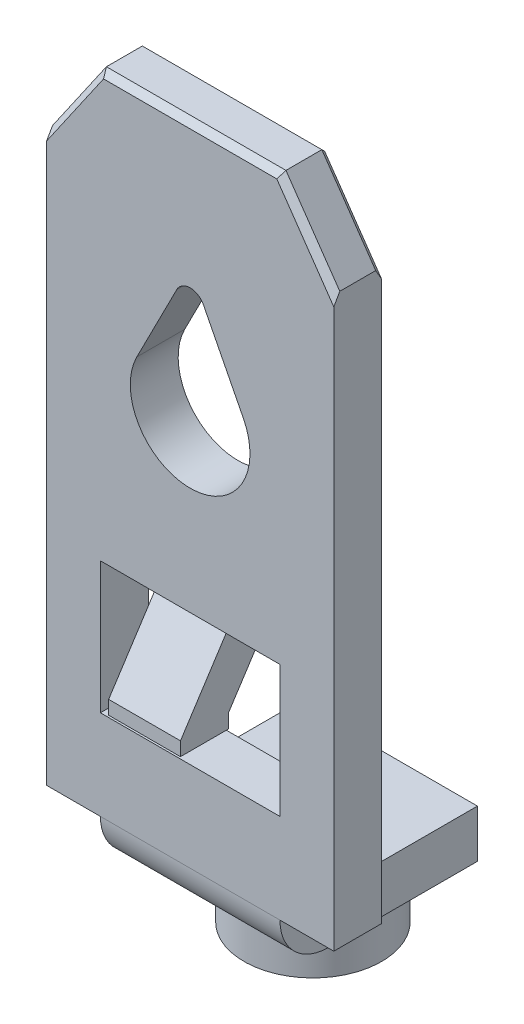
ISO-10303-21;
HEADER;
FILE_DESCRIPTION(('STEP AP214'),'2;1');
FILE_NAME('part.step','',(''),(''),'','','');
FILE_SCHEMA(('AUTOMOTIVE_DESIGN { 1 0 10303 214 1 1 1 1 }'));
ENDSEC;
DATA;
#1=APPLICATION_CONTEXT('core data for automotive mechanical design processes');
#2=APPLICATION_PROTOCOL_DEFINITION('international standard','automotive_design',2000,#1);
#3=PRODUCT_CONTEXT('',#1,'mechanical');
#4=PRODUCT('Part','Part','',(#3));
#5=PRODUCT_RELATED_PRODUCT_CATEGORY('part','',(#4));
#6=PRODUCT_DEFINITION_FORMATION('','',#4);
#7=PRODUCT_DEFINITION_CONTEXT('part definition',#1,'design');
#8=PRODUCT_DEFINITION('design','',#6,#7);
#9=PRODUCT_DEFINITION_SHAPE('','',#8);
#10=(LENGTH_UNIT() NAMED_UNIT(*) SI_UNIT(.MILLI.,.METRE.));
#11=(NAMED_UNIT(*) PLANE_ANGLE_UNIT() SI_UNIT($,.RADIAN.));
#12=(NAMED_UNIT(*) SI_UNIT($,.STERADIAN.) SOLID_ANGLE_UNIT());
#13=UNCERTAINTY_MEASURE_WITH_UNIT(LENGTH_MEASURE(1.E-05),#10,'distance_accuracy_value','');
#14=(GEOMETRIC_REPRESENTATION_CONTEXT(3) GLOBAL_UNCERTAINTY_ASSIGNED_CONTEXT((#13)) GLOBAL_UNIT_ASSIGNED_CONTEXT((#10,
#11,#12)) REPRESENTATION_CONTEXT('',''));
#15=CARTESIAN_POINT('',(0.,0.,0.));
#16=DIRECTION('',(0.,0.,1.));
#17=DIRECTION('',(1.,0.,0.));
#18=AXIS2_PLACEMENT_3D('',#15,#16,#17);
#19=CARTESIAN_POINT('',(4.00000001490116,1.22586121977757,1.56249464902104));
#20=DIRECTION('',(0.,0.,1.));
#21=DIRECTION('',(1.,0.,0.));
#22=AXIS2_PLACEMENT_3D('',#19,#20,#21);
#23=PLANE('',#22);
#24=DIRECTION('',(1.,0.,0.));
#25=VECTOR('',#24,1.);
#26=CARTESIAN_POINT('',(2.80000001490116,1.22586121977757,1.56249464902104));
#27=LINE('',#26,#25);
#28=CARTESIAN_POINT('',(2.80000001490116,1.22586121977757,1.56249464902104));
#29=VERTEX_POINT('',#28);
#30=CARTESIAN_POINT('',(4.00000001490116,1.22586121977757,1.56249464902104));
#31=VERTEX_POINT('',#30);
#32=EDGE_CURVE('E41',#29,#31,#27,.T.);
#33=ORIENTED_EDGE('',*,*,#32,.F.);
#34=DIRECTION('',(0.,-1.,0.));
#35=VECTOR('',#34,1.);
#36=CARTESIAN_POINT('',(2.80000001490116,1.22586121977757,1.56249464902104));
#37=LINE('',#36,#35);
#38=CARTESIAN_POINT('',(2.80000001490116,0.995861219777567,1.56249464902104));
#39=VERTEX_POINT('',#38);
#40=EDGE_CURVE('E11',#29,#39,#37,.T.);
#41=ORIENTED_EDGE('',*,*,#40,.T.);
#42=DIRECTION('',(-1.,0.,0.));
#43=VECTOR('',#42,1.);
#44=CARTESIAN_POINT('',(2.80000001490116,0.995861219777567,1.56249464902104));
#45=LINE('',#44,#43);
#46=CARTESIAN_POINT('',(4.00000001490116,0.995861219777567,1.56249464902104));
#47=VERTEX_POINT('',#46);
#48=EDGE_CURVE('E458',#47,#39,#45,.T.);
#49=ORIENTED_EDGE('',*,*,#48,.F.);
#50=DIRECTION('',(0.,-1.,0.));
#51=VECTOR('',#50,1.);
#52=CARTESIAN_POINT('',(4.00000001490116,1.22586121977757,1.56249464902104));
#53=LINE('',#52,#51);
#54=EDGE_CURVE('E431',#31,#47,#53,.T.);
#55=ORIENTED_EDGE('',*,*,#54,.F.);
#56=EDGE_LOOP('',(#33,#41,#49,#55));
#57=FACE_BOUND('',#56,.T.);
#58=ADVANCED_FACE('F17',(#57),#23,.T.);
#59=CARTESIAN_POINT('',(2.80000001490116,1.22586121977757,0.762494649021038));
#60=DIRECTION('',(0.,0.,-1.));
#61=DIRECTION('',(0.,-1.,0.));
#62=AXIS2_PLACEMENT_3D('',#59,#60,#61);
#63=PLANE('',#62);
#64=DIRECTION('',(1.,0.,0.));
#65=VECTOR('',#64,1.);
#66=CARTESIAN_POINT('',(2.80000001490116,1.22586121977757,0.762494649021038));
#67=LINE('',#66,#65);
#68=CARTESIAN_POINT('',(2.80000001490116,1.22586121977757,0.762494649021038));
#69=VERTEX_POINT('',#68);
#70=CARTESIAN_POINT('',(4.00000001490116,1.22586121977757,0.762494649021038));
#71=VERTEX_POINT('',#70);
#72=EDGE_CURVE('E28',#69,#71,#67,.T.);
#73=ORIENTED_EDGE('',*,*,#72,.T.);
#74=DIRECTION('',(0.,-1.,0.));
#75=VECTOR('',#74,1.);
#76=CARTESIAN_POINT('',(4.00000001490116,1.22586121977757,0.762494649021038));
#77=LINE('',#76,#75);
#78=CARTESIAN_POINT('',(4.00000001490116,0.995861219777567,0.762494649021038));
#79=VERTEX_POINT('',#78);
#80=EDGE_CURVE('E352',#71,#79,#77,.T.);
#81=ORIENTED_EDGE('',*,*,#80,.T.);
#82=DIRECTION('',(1.,0.,0.));
#83=VECTOR('',#82,1.);
#84=CARTESIAN_POINT('',(2.80000001490116,0.995861219777567,0.762494649021038));
#85=LINE('',#84,#83);
#86=CARTESIAN_POINT('',(2.80000001490116,0.995861219777567,0.762494649021038));
#87=VERTEX_POINT('',#86);
#88=EDGE_CURVE('E373',#87,#79,#85,.T.);
#89=ORIENTED_EDGE('',*,*,#88,.F.);
#90=DIRECTION('',(0.,-1.,0.));
#91=VECTOR('',#90,1.);
#92=CARTESIAN_POINT('',(2.80000001490116,1.22586121977757,0.762494649021038));
#93=LINE('',#92,#91);
#94=EDGE_CURVE('E430',#69,#87,#93,.T.);
#95=ORIENTED_EDGE('',*,*,#94,.F.);
#96=EDGE_LOOP('',(#73,#81,#89,#95));
#97=FACE_BOUND('',#96,.T.);
#98=ADVANCED_FACE('F19',(#97),#63,.T.);
#99=CARTESIAN_POINT('',(2.80000001490116,0.995861219777567,1.56249464902104));
#100=DIRECTION('',(0.,-1.,0.));
#101=DIRECTION('',(0.,0.,-1.));
#102=AXIS2_PLACEMENT_3D('',#99,#100,#101);
#103=PLANE('',#102);
#104=DIRECTION('',(0.,0.,-1.));
#105=VECTOR('',#104,1.);
#106=CARTESIAN_POINT('',(2.80000001490116,0.995861219777567,0.762494649021038));
#107=LINE('',#106,#105);
#108=EDGE_CURVE('E356',#39,#87,#107,.T.);
#109=ORIENTED_EDGE('',*,*,#108,.T.);
#110=ORIENTED_EDGE('',*,*,#88,.T.);
#111=DIRECTION('',(0.,0.,1.));
#112=VECTOR('',#111,1.);
#113=CARTESIAN_POINT('',(4.00000001490116,0.995861219777567,0.762494649021038));
#114=LINE('',#113,#112);
#115=EDGE_CURVE('E454',#79,#47,#114,.T.);
#116=ORIENTED_EDGE('',*,*,#115,.T.);
#117=ORIENTED_EDGE('',*,*,#48,.T.);
#118=EDGE_LOOP('',(#109,#110,#116,#117));
#119=FACE_BOUND('',#118,.T.);
#120=ADVANCED_FACE('F710',(#119),#103,.T.);
#121=CARTESIAN_POINT('',(2.80000001490116,1.22586121977757,0.762494649021038));
#122=DIRECTION('',(0.,-0.544639035015027,-0.838670567945424));
#123=DIRECTION('',(0.,-0.838670567945424,0.544639035015027));
#124=AXIS2_PLACEMENT_3D('',#121,#122,#123);
#125=PLANE('',#124);
#126=DIRECTION('',(0.,-0.838670567945424,0.544639035015027));
#127=VECTOR('',#126,1.);
#128=CARTESIAN_POINT('',(2.80000001490116,2.40000001490116,0.));
#129=LINE('',#128,#127);
#130=CARTESIAN_POINT('',(2.80000001490116,2.40000001490116,0.));
#131=VERTEX_POINT('',#130);
#132=EDGE_CURVE('E335',#131,#69,#129,.T.);
#133=ORIENTED_EDGE('',*,*,#132,.F.);
#134=DIRECTION('',(1.,0.,0.));
#135=VECTOR('',#134,1.);
#136=CARTESIAN_POINT('',(1.90000001490116,2.40000001490116,0.));
#137=LINE('',#136,#135);
#138=CARTESIAN_POINT('',(4.00000001490116,2.40000001490116,0.));
#139=VERTEX_POINT('',#138);
#140=EDGE_CURVE('E482',#131,#139,#137,.T.);
#141=ORIENTED_EDGE('',*,*,#140,.T.);
#142=DIRECTION('',(0.,0.838670567945424,-0.544639035015027));
#143=VECTOR('',#142,1.);
#144=CARTESIAN_POINT('',(4.00000001490116,2.40000001490116,0.));
#145=LINE('',#144,#143);
#146=EDGE_CURVE('E331',#71,#139,#145,.T.);
#147=ORIENTED_EDGE('',*,*,#146,.F.);
#148=ORIENTED_EDGE('',*,*,#72,.F.);
#149=EDGE_LOOP('',(#133,#141,#147,#148));
#150=FACE_BOUND('',#149,.T.);
#151=ADVANCED_FACE('F869',(#150),#125,.T.);
#152=CARTESIAN_POINT('',(2.80000001490116,2.40000001490116,0.8));
#153=DIRECTION('',(0.,0.544639035015027,0.838670567945424));
#154=DIRECTION('',(1.,0.,0.));
#155=AXIS2_PLACEMENT_3D('',#152,#153,#154);
#156=PLANE('',#155);
#157=DIRECTION('',(0.,-0.838670567945424,0.544639035015027));
#158=VECTOR('',#157,1.);
#159=CARTESIAN_POINT('',(2.80000001490116,2.40000001490116,0.8));
#160=LINE('',#159,#158);
#161=CARTESIAN_POINT('',(2.80000001490116,2.40000001490116,0.8));
#162=VERTEX_POINT('',#161);
#163=EDGE_CURVE('E334',#162,#29,#160,.T.);
#164=ORIENTED_EDGE('',*,*,#163,.T.);
#165=ORIENTED_EDGE('',*,*,#32,.T.);
#166=DIRECTION('',(0.,-0.838670567945424,0.544639035015027));
#167=VECTOR('',#166,1.);
#168=CARTESIAN_POINT('',(4.00000001490116,2.40000001490116,0.8));
#169=LINE('',#168,#167);
#170=CARTESIAN_POINT('',(4.00000001490116,2.40000001490116,0.8));
#171=VERTEX_POINT('',#170);
#172=EDGE_CURVE('E426',#171,#31,#169,.T.);
#173=ORIENTED_EDGE('',*,*,#172,.F.);
#174=DIRECTION('',(1.,0.,0.));
#175=VECTOR('',#174,1.);
#176=CARTESIAN_POINT('',(1.90000001490116,2.40000001490116,0.8));
#177=LINE('',#176,#175);
#178=EDGE_CURVE('E300',#162,#171,#177,.T.);
#179=ORIENTED_EDGE('',*,*,#178,.F.);
#180=EDGE_LOOP('',(#164,#165,#173,#179));
#181=FACE_BOUND('',#180,.T.);
#182=ADVANCED_FACE('F690',(#181),#156,.T.);
#183=CARTESIAN_POINT('',(2.80000001490116,1.81293061733936,0.781247324510519));
#184=DIRECTION('',(-1.,0.,0.));
#185=DIRECTION('',(0.,0.,1.));
#186=AXIS2_PLACEMENT_3D('',#183,#184,#185);
#187=PLANE('',#186);
#188=DIRECTION('',(0.,0.,1.));
#189=VECTOR('',#188,1.);
#190=CARTESIAN_POINT('',(2.80000001490116,2.40000001490116,0.390623662255259));
#191=LINE('',#190,#189);
#192=EDGE_CURVE('E526',#131,#162,#191,.T.);
#193=ORIENTED_EDGE('',*,*,#192,.F.);
#194=ORIENTED_EDGE('',*,*,#132,.T.);
#195=ORIENTED_EDGE('',*,*,#94,.T.);
#196=ORIENTED_EDGE('',*,*,#108,.F.);
#197=ORIENTED_EDGE('',*,*,#40,.F.);
#198=ORIENTED_EDGE('',*,*,#163,.F.);
#199=EDGE_LOOP('',(#193,#194,#195,#196,#197,#198));
#200=FACE_BOUND('',#199,.T.);
#201=ADVANCED_FACE('F868',(#200),#187,.T.);
#202=CARTESIAN_POINT('',(4.00000001490116,1.81293061733936,0.781247324510519));
#203=DIRECTION('',(1.,0.,0.));
#204=DIRECTION('',(0.,1.,0.));
#205=AXIS2_PLACEMENT_3D('',#202,#203,#204);
#206=PLANE('',#205);
#207=DIRECTION('',(0.,0.,-1.));
#208=VECTOR('',#207,1.);
#209=CARTESIAN_POINT('',(4.00000001490116,2.40000001490116,0.390623662255259));
#210=LINE('',#209,#208);
#211=EDGE_CURVE('E318',#171,#139,#210,.T.);
#212=ORIENTED_EDGE('',*,*,#211,.F.);
#213=ORIENTED_EDGE('',*,*,#172,.T.);
#214=ORIENTED_EDGE('',*,*,#54,.T.);
#215=ORIENTED_EDGE('',*,*,#115,.F.);
#216=ORIENTED_EDGE('',*,*,#80,.F.);
#217=ORIENTED_EDGE('',*,*,#146,.T.);
#218=EDGE_LOOP('',(#212,#213,#214,#215,#216,#217));
#219=FACE_BOUND('',#218,.T.);
#220=ADVANCED_FACE('F687',(#219),#206,.T.);
#221=CARTESIAN_POINT('',(4.00000001490116,2.40000001490116,0.));
#222=DIRECTION('',(0.,-1.,0.));
#223=DIRECTION('',(0.,0.,-1.));
#224=AXIS2_PLACEMENT_3D('',#221,#222,#223);
#225=PLANE('',#224);
#226=ORIENTED_EDGE('',*,*,#211,.T.);
#227=DIRECTION('',(1.,0.,0.));
#228=VECTOR('',#227,1.);
#229=CARTESIAN_POINT('',(1.90000001490116,2.40000001490116,0.));
#230=LINE('',#229,#228);
#231=CARTESIAN_POINT('',(4.90000001490116,2.40000001490116,0.));
#232=VERTEX_POINT('',#231);
#233=EDGE_CURVE('E314',#139,#232,#230,.T.);
#234=ORIENTED_EDGE('',*,*,#233,.T.);
#235=DIRECTION('',(0.,0.,1.));
#236=VECTOR('',#235,1.);
#237=CARTESIAN_POINT('',(4.90000001490116,2.40000001490116,0.));
#238=LINE('',#237,#236);
#239=CARTESIAN_POINT('',(4.90000001490116,2.40000001490116,0.8));
#240=VERTEX_POINT('',#239);
#241=EDGE_CURVE('E319',#232,#240,#238,.T.);
#242=ORIENTED_EDGE('',*,*,#241,.T.);
#243=DIRECTION('',(1.,0.,0.));
#244=VECTOR('',#243,1.);
#245=CARTESIAN_POINT('',(1.90000001490116,2.40000001490116,0.8));
#246=LINE('',#245,#244);
#247=EDGE_CURVE('E303',#171,#240,#246,.T.);
#248=ORIENTED_EDGE('',*,*,#247,.F.);
#249=EDGE_LOOP('',(#226,#234,#242,#248));
#250=FACE_BOUND('',#249,.T.);
#251=ADVANCED_FACE('F691',(#250),#225,.T.);
#252=CARTESIAN_POINT('',(4.00000001490116,2.40000001490116,0.));
#253=DIRECTION('',(0.,-1.,0.));
#254=DIRECTION('',(0.,0.,-1.));
#255=AXIS2_PLACEMENT_3D('',#252,#253,#254);
#256=PLANE('',#255);
#257=ORIENTED_EDGE('',*,*,#192,.T.);
#258=DIRECTION('',(1.,0.,0.));
#259=VECTOR('',#258,1.);
#260=CARTESIAN_POINT('',(1.90000001490116,2.40000001490116,0.8));
#261=LINE('',#260,#259);
#262=CARTESIAN_POINT('',(1.90000001490116,2.40000001490116,0.8));
#263=VERTEX_POINT('',#262);
#264=EDGE_CURVE('E302',#263,#162,#261,.T.);
#265=ORIENTED_EDGE('',*,*,#264,.F.);
#266=DIRECTION('',(0.,0.,1.));
#267=VECTOR('',#266,1.);
#268=CARTESIAN_POINT('',(1.90000001490116,2.40000001490116,0.));
#269=LINE('',#268,#267);
#270=CARTESIAN_POINT('',(1.90000001490116,2.40000001490116,0.));
#271=VERTEX_POINT('',#270);
#272=EDGE_CURVE('E487',#271,#263,#269,.T.);
#273=ORIENTED_EDGE('',*,*,#272,.F.);
#274=DIRECTION('',(1.,0.,0.));
#275=VECTOR('',#274,1.);
#276=CARTESIAN_POINT('',(1.90000001490116,2.40000001490116,0.));
#277=LINE('',#276,#275);
#278=EDGE_CURVE('E529',#271,#131,#277,.T.);
#279=ORIENTED_EDGE('',*,*,#278,.T.);
#280=EDGE_LOOP('',(#257,#265,#273,#279));
#281=FACE_BOUND('',#280,.T.);
#282=ADVANCED_FACE('F680',(#281),#256,.T.);
#283=CARTESIAN_POINT('',(3.40000001490116,3.70000001490116,0.));
#284=DIRECTION('',(0.,0.,1.));
#285=DIRECTION('',(1.,0.,0.));
#286=AXIS2_PLACEMENT_3D('',#283,#284,#285);
#287=PLANE('',#286);
#288=DIRECTION('',(-1.,0.,0.));
#289=VECTOR('',#288,1.);
#290=CARTESIAN_POINT('',(4.37500001490116,-1.29999998509884,0.));
#291=LINE('',#290,#289);
#292=CARTESIAN_POINT('',(5.80000001490116,-1.29999998509884,0.));
#293=VERTEX_POINT('',#292);
#294=CARTESIAN_POINT('',(4.90000001490116,-1.29999998509884,0.));
#295=VERTEX_POINT('',#294);
#296=EDGE_CURVE('E365',#293,#295,#291,.T.);
#297=ORIENTED_EDGE('',*,*,#296,.T.);
#298=DIRECTION('',(-1.,0.,0.));
#299=VECTOR('',#298,1.);
#300=CARTESIAN_POINT('',(2.65000001490116,-1.29999998509884,0.));
#301=LINE('',#300,#299);
#302=CARTESIAN_POINT('',(1.90000001490116,-1.29999998509884,0.));
#303=VERTEX_POINT('',#302);
#304=EDGE_CURVE('E361',#295,#303,#301,.T.);
#305=ORIENTED_EDGE('',*,*,#304,.T.);
#306=DIRECTION('',(-1.,0.,0.));
#307=VECTOR('',#306,1.);
#308=CARTESIAN_POINT('',(2.42500001490116,-1.29999998509884,0.));
#309=LINE('',#308,#307);
#310=CARTESIAN_POINT('',(1.00000001490116,-1.29999998509884,0.));
#311=VERTEX_POINT('',#310);
#312=EDGE_CURVE('E366',#303,#311,#309,.T.);
#313=ORIENTED_EDGE('',*,*,#312,.T.);
#314=DIRECTION('',(0.,1.,0.));
#315=VECTOR('',#314,1.);
#316=CARTESIAN_POINT('',(1.00000001490116,1.00000001490116,0.));
#317=LINE('',#316,#315);
#318=CARTESIAN_POINT('',(1.00000001490116,8.02431792266959,0.));
#319=VERTEX_POINT('',#318);
#320=EDGE_CURVE('E374',#311,#319,#317,.T.);
#321=ORIENTED_EDGE('',*,*,#320,.T.);
#322=DIRECTION('',(-0.569209978830308,-0.822192191643779,0.));
#323=VECTOR('',#322,1.);
#324=CARTESIAN_POINT('',(0.868019234065539,7.83367901701813,0.));
#325=LINE('',#324,#323);
#326=CARTESIAN_POINT('',(1.95239530952302,9.40000001490116,0.));
#327=VERTEX_POINT('',#326);
#328=EDGE_CURVE('E211',#327,#319,#325,.T.);
#329=ORIENTED_EDGE('',*,*,#328,.F.);
#330=DIRECTION('',(-1.,0.,0.));
#331=VECTOR('',#330,1.);
#332=CARTESIAN_POINT('',(4.15000001490116,9.40000001490116,0.));
#333=LINE('',#332,#331);
#334=CARTESIAN_POINT('',(4.8476047202793,9.40000001490116,0.));
#335=VERTEX_POINT('',#334);
#336=EDGE_CURVE('E357',#335,#327,#333,.T.);
#337=ORIENTED_EDGE('',*,*,#336,.F.);
#338=DIRECTION('',(-0.569209978830308,0.822192191643779,0.));
#339=VECTOR('',#338,1.);
#340=CARTESIAN_POINT('',(6.38198079573678,7.18367901701813,0.));
#341=LINE('',#340,#339);
#342=CARTESIAN_POINT('',(5.80000001490116,8.02431792266959,0.));
#343=VERTEX_POINT('',#342);
#344=EDGE_CURVE('E351',#343,#335,#341,.T.);
#345=ORIENTED_EDGE('',*,*,#344,.F.);
#346=DIRECTION('',(0.,1.,0.));
#347=VECTOR('',#346,1.);
#348=CARTESIAN_POINT('',(5.80000001490116,-1.29999998509884,0.));
#349=LINE('',#348,#347);
#350=EDGE_CURVE('E327',#293,#343,#349,.T.);
#351=ORIENTED_EDGE('',*,*,#350,.F.);
#352=EDGE_LOOP('',(#297,#305,#313,#321,#329,#337,#345,#351));
#353=FACE_BOUND('',#352,.T.);
#354=CARTESIAN_POINT('',(3.39907908867342,5.20000001490116,0.));
#355=DIRECTION('',(0.,0.,-1.));
#356=DIRECTION('',(-0.890723542830247,0.454545454545454,0.));
#357=AXIS2_PLACEMENT_3D('',#354,#355,#356);
#358=CIRCLE('',#357,1.);
#359=CARTESIAN_POINT('',(4.28980263150367,5.65454546944661,0.));
#360=VERTEX_POINT('',#359);
#361=CARTESIAN_POINT('',(2.50835554584317,5.65454546944662,0.));
#362=VERTEX_POINT('',#361);
#363=EDGE_CURVE('E255',#360,#362,#358,.T.);
#364=ORIENTED_EDGE('',*,*,#363,.F.);
#365=DIRECTION('',(0.454545454545455,-0.890723542830246,0.));
#366=VECTOR('',#365,1.);
#367=CARTESIAN_POINT('',(4.28980263150367,5.65454546944662,0.));
#368=LINE('',#367,#366);
#369=CARTESIAN_POINT('',(3.62175997438098,6.96363637853752,0.));
#370=VERTEX_POINT('',#369);
#371=EDGE_CURVE('E414',#370,#360,#368,.T.);
#372=ORIENTED_EDGE('',*,*,#371,.F.);
#373=CARTESIAN_POINT('',(3.39907908867342,6.85000001490116,0.));
#374=DIRECTION('',(0.,0.,-1.));
#375=DIRECTION('',(0.890723542830249,0.454545454545449,0.));
#376=AXIS2_PLACEMENT_3D('',#373,#374,#375);
#377=CIRCLE('',#376,0.25);
#378=CARTESIAN_POINT('',(3.17639820296586,6.96363637853752,0.));
#379=VERTEX_POINT('',#378);
#380=EDGE_CURVE('E274',#379,#370,#377,.T.);
#381=ORIENTED_EDGE('',*,*,#380,.F.);
#382=DIRECTION('',(0.454545454545455,0.890723542830246,0.));
#383=VECTOR('',#382,1.);
#384=CARTESIAN_POINT('',(2.50835554584317,5.65454546944662,0.));
#385=LINE('',#384,#383);
#386=EDGE_CURVE('E270',#362,#379,#385,.T.);
#387=ORIENTED_EDGE('',*,*,#386,.F.);
#388=EDGE_LOOP('',(#364,#372,#381,#387));
#389=FACE_BOUND('',#388,.T.);
#390=ORIENTED_EDGE('',*,*,#278,.F.);
#391=DIRECTION('',(0.,1.,0.));
#392=VECTOR('',#391,1.);
#393=CARTESIAN_POINT('',(1.90000001490116,2.40000001490116,0.));
#394=LINE('',#393,#392);
#395=CARTESIAN_POINT('',(1.90000001490116,0.200000014901161,0.));
#396=VERTEX_POINT('',#395);
#397=EDGE_CURVE('E309',#396,#271,#394,.T.);
#398=ORIENTED_EDGE('',*,*,#397,.F.);
#399=DIRECTION('',(-1.,0.,0.));
#400=VECTOR('',#399,1.);
#401=CARTESIAN_POINT('',(1.90000001490116,0.200000014901161,0.));
#402=LINE('',#401,#400);
#403=CARTESIAN_POINT('',(4.90000001490116,0.200000014901161,0.));
#404=VERTEX_POINT('',#403);
#405=EDGE_CURVE('E287',#404,#396,#402,.T.);
#406=ORIENTED_EDGE('',*,*,#405,.F.);
#407=DIRECTION('',(0.,-1.,0.));
#408=VECTOR('',#407,1.);
#409=CARTESIAN_POINT('',(4.90000001490116,1.00000001490116,0.));
#410=LINE('',#409,#408);
#411=EDGE_CURVE('E308',#232,#404,#410,.T.);
#412=ORIENTED_EDGE('',*,*,#411,.F.);
#413=ORIENTED_EDGE('',*,*,#233,.F.);
#414=ORIENTED_EDGE('',*,*,#140,.F.);
#415=EDGE_LOOP('',(#390,#398,#406,#412,#413,#414));
#416=FACE_BOUND('',#415,.T.);
#417=ADVANCED_FACE('F271',(#353,#389,#416),#287,.F.);
#418=CARTESIAN_POINT('',(3.40000001490116,-2.09999998509884,-1.25));
#419=DIRECTION('',(0.,-1.,0.));
#420=DIRECTION('',(1.,0.,0.));
#421=AXIS2_PLACEMENT_3D('',#418,#419,#420);
#422=CYLINDRICAL_SURFACE('',#421,1.15);
#423=CARTESIAN_POINT('',(3.40000001490116,-3.09999998509884,-1.25));
#424=DIRECTION('',(0.,-1.,0.));
#425=DIRECTION('',(1.,0.,0.));
#426=AXIS2_PLACEMENT_3D('',#423,#424,#425);
#427=CIRCLE('',#426,1.15);
#428=CARTESIAN_POINT('',(2.25000001490116,-3.09999998509884,-1.25));
#429=VERTEX_POINT('',#428);
#430=EDGE_CURVE('E378',#429,#429,#427,.T.);
#431=ORIENTED_EDGE('',*,*,#430,.F.);
#432=DIRECTION('',(0.,1.,0.));
#433=VECTOR('',#432,1.);
#434=CARTESIAN_POINT('',(2.25000001490116,-2.09999998509884,-1.25));
#435=LINE('',#434,#433);
#436=CARTESIAN_POINT('',(2.25000001490116,-2.09999998509884,-1.25));
#437=VERTEX_POINT('',#436);
#438=EDGE_CURVE('E377',#429,#437,#435,.T.);
#439=ORIENTED_EDGE('',*,*,#438,.T.);
#440=CARTESIAN_POINT('',(3.40000001490116,-2.09999998509884,-1.25));
#441=DIRECTION('',(0.,1.,0.));
#442=DIRECTION('',(1.,0.,0.));
#443=AXIS2_PLACEMENT_3D('',#440,#441,#442);
#444=CIRCLE('',#443,1.15);
#445=EDGE_CURVE('E419',#437,#437,#444,.T.);
#446=ORIENTED_EDGE('',*,*,#445,.F.);
#447=ORIENTED_EDGE('',*,*,#438,.F.);
#448=EDGE_LOOP('',(#431,#439,#446,#447));
#449=FACE_BOUND('',#448,.T.);
#450=ADVANCED_FACE('F820',(#449),#422,.T.);
#451=CARTESIAN_POINT('',(3.40000001490116,-3.09999998509884,-1.25));
#452=DIRECTION('',(0.,-1.,0.));
#453=DIRECTION('',(0.,0.,-1.));
#454=AXIS2_PLACEMENT_3D('',#451,#452,#453);
#455=PLANE('',#454);
#456=ORIENTED_EDGE('',*,*,#430,.T.);
#457=EDGE_LOOP('',(#456));
#458=FACE_BOUND('',#457,.T.);
#459=ADVANCED_FACE('F714',(#458),#455,.T.);
#460=CARTESIAN_POINT('',(2.20000001490116,-1.29999998509884,0.));
#461=DIRECTION('',(1.,0.,0.));
#462=DIRECTION('',(0.,-0.707106781186548,0.707106781186548));
#463=AXIS2_PLACEMENT_3D('',#460,#461,#462);
#464=CYLINDRICAL_SURFACE('',#463,0.8);
#465=CARTESIAN_POINT('',(4.90000001490116,-1.29999998509884,0.));
#466=DIRECTION('',(-1.,0.,0.));
#467=DIRECTION('',(0.,-0.707106781186548,0.707106781186548));
#468=AXIS2_PLACEMENT_3D('',#465,#466,#467);
#469=CIRCLE('',#468,0.8);
#470=CARTESIAN_POINT('',(4.90000001490116,-2.09999998509884,0.));
#471=VERTEX_POINT('',#470);
#472=CARTESIAN_POINT('',(4.90000001490116,-1.29999998509884,0.799999982118607));
#473=VERTEX_POINT('',#472);
#474=EDGE_CURVE('E298',#471,#473,#469,.T.);
#475=ORIENTED_EDGE('',*,*,#474,.T.);
#476=DIRECTION('',(-1.,0.,0.));
#477=VECTOR('',#476,1.);
#478=CARTESIAN_POINT('',(2.20000001490116,-1.29999998509884,0.8));
#479=LINE('',#478,#477);
#480=CARTESIAN_POINT('',(1.90000001490116,-1.29999998509884,0.799999982118607));
#481=VERTEX_POINT('',#480);
#482=EDGE_CURVE('E386',#473,#481,#479,.T.);
#483=ORIENTED_EDGE('',*,*,#482,.T.);
#484=CARTESIAN_POINT('',(1.90000001490116,-1.29999998509884,0.));
#485=DIRECTION('',(1.,0.,0.));
#486=DIRECTION('',(0.,-0.707106781186548,0.707106781186548));
#487=AXIS2_PLACEMENT_3D('',#484,#485,#486);
#488=CIRCLE('',#487,0.8);
#489=CARTESIAN_POINT('',(1.90000001490116,-2.09999998509884,0.));
#490=VERTEX_POINT('',#489);
#491=EDGE_CURVE('E382',#481,#490,#488,.T.);
#492=ORIENTED_EDGE('',*,*,#491,.T.);
#493=DIRECTION('',(1.,0.,0.));
#494=VECTOR('',#493,1.);
#495=CARTESIAN_POINT('',(2.20000001490116,-2.09999998509884,0.));
#496=LINE('',#495,#494);
#497=EDGE_CURVE('E387',#490,#471,#496,.T.);
#498=ORIENTED_EDGE('',*,*,#497,.T.);
#499=EDGE_LOOP('',(#475,#483,#492,#498));
#500=FACE_BOUND('',#499,.T.);
#501=ADVANCED_FACE('F554',(#500),#464,.T.);
#502=CARTESIAN_POINT('',(1.00000001490116,-2.09999998509884,0.));
#503=DIRECTION('',(0.,-1.,0.));
#504=DIRECTION('',(0.,0.,-1.));
#505=AXIS2_PLACEMENT_3D('',#502,#503,#504);
#506=PLANE('',#505);
#507=ORIENTED_EDGE('',*,*,#497,.F.);
#508=DIRECTION('',(0.,0.,-1.));
#509=VECTOR('',#508,1.);
#510=CARTESIAN_POINT('',(1.90000001490116,-2.09999998509884,0.399999991059303));
#511=LINE('',#510,#509);
#512=CARTESIAN_POINT('',(1.90000001490116,-2.09999998509884,-2.5));
#513=VERTEX_POINT('',#512);
#514=EDGE_CURVE('E478',#490,#513,#511,.T.);
#515=ORIENTED_EDGE('',*,*,#514,.T.);
#516=DIRECTION('',(-1.,0.,0.));
#517=VECTOR('',#516,1.);
#518=CARTESIAN_POINT('',(4.90000001490116,-2.09999998509884,-2.5));
#519=LINE('',#518,#517);
#520=CARTESIAN_POINT('',(4.90000001490116,-2.09999998509884,-2.5));
#521=VERTEX_POINT('',#520);
#522=EDGE_CURVE('E336',#521,#513,#519,.T.);
#523=ORIENTED_EDGE('',*,*,#522,.F.);
#524=DIRECTION('',(0.,0.,1.));
#525=VECTOR('',#524,1.);
#526=CARTESIAN_POINT('',(4.90000001490116,-2.09999998509884,0.));
#527=LINE('',#526,#525);
#528=EDGE_CURVE('E21',#521,#471,#527,.T.);
#529=ORIENTED_EDGE('',*,*,#528,.T.);
#530=EDGE_LOOP('',(#507,#515,#523,#529));
#531=FACE_BOUND('',#530,.T.);
#532=ORIENTED_EDGE('',*,*,#445,.T.);
#533=EDGE_LOOP('',(#532));
#534=FACE_BOUND('',#533,.T.);
#535=ADVANCED_FACE('F752',(#531,#534),#506,.T.);
#536=CARTESIAN_POINT('',(1.90000001490116,-2.09999998509884,0.));
#537=DIRECTION('',(-1.,0.,0.));
#538=DIRECTION('',(0.,0.,1.));
#539=AXIS2_PLACEMENT_3D('',#536,#537,#538);
#540=PLANE('',#539);
#541=ORIENTED_EDGE('',*,*,#491,.F.);
#542=DIRECTION('',(0.,0.,-1.));
#543=VECTOR('',#542,1.);
#544=CARTESIAN_POINT('',(1.90000001490116,-1.29999998509884,0.));
#545=LINE('',#544,#543);
#546=EDGE_CURVE('E423',#481,#303,#545,.T.);
#547=ORIENTED_EDGE('',*,*,#546,.T.);
#548=DIRECTION('',(0.,0.,-1.));
#549=VECTOR('',#548,1.);
#550=CARTESIAN_POINT('',(1.90000001490116,-1.29999998509884,0.));
#551=LINE('',#550,#549);
#552=CARTESIAN_POINT('',(1.90000001490116,-1.29999998509884,-2.5));
#553=VERTEX_POINT('',#552);
#554=EDGE_CURVE('E346',#303,#553,#551,.T.);
#555=ORIENTED_EDGE('',*,*,#554,.T.);
#556=DIRECTION('',(0.,1.,0.));
#557=VECTOR('',#556,1.);
#558=CARTESIAN_POINT('',(1.90000001490116,-2.09999998509884,-2.5));
#559=LINE('',#558,#557);
#560=EDGE_CURVE('E520',#513,#553,#559,.T.);
#561=ORIENTED_EDGE('',*,*,#560,.F.);
#562=ORIENTED_EDGE('',*,*,#514,.F.);
#563=EDGE_LOOP('',(#541,#547,#555,#561,#562));
#564=FACE_BOUND('',#563,.T.);
#565=ADVANCED_FACE('F743',(#564),#540,.T.);
#566=CARTESIAN_POINT('',(5.35000001490116,-1.29999998509884,0.4));
#567=DIRECTION('',(0.,1.,0.));
#568=DIRECTION('',(1.,0.,0.));
#569=AXIS2_PLACEMENT_3D('',#566,#567,#568);
#570=PLANE('',#569);
#571=DIRECTION('',(0.,0.,-1.));
#572=VECTOR('',#571,1.);
#573=CARTESIAN_POINT('',(5.80000001490116,-1.29999998509884,0.2));
#574=LINE('',#573,#572);
#575=CARTESIAN_POINT('',(5.80000001490116,-1.29999998509884,0.8));
#576=VERTEX_POINT('',#575);
#577=EDGE_CURVE('E342',#576,#293,#574,.T.);
#578=ORIENTED_EDGE('',*,*,#577,.F.);
#579=DIRECTION('',(1.,0.,0.));
#580=VECTOR('',#579,1.);
#581=CARTESIAN_POINT('',(4.37500001490116,-1.29999998509884,0.8));
#582=LINE('',#581,#580);
#583=EDGE_CURVE('E418',#473,#576,#582,.T.);
#584=ORIENTED_EDGE('',*,*,#583,.F.);
#585=DIRECTION('',(0.,0.,1.));
#586=VECTOR('',#585,1.);
#587=CARTESIAN_POINT('',(4.90000001490116,-1.29999998509884,0.));
#588=LINE('',#587,#586);
#589=EDGE_CURVE('E328',#295,#473,#588,.T.);
#590=ORIENTED_EDGE('',*,*,#589,.F.);
#591=ORIENTED_EDGE('',*,*,#296,.F.);
#592=EDGE_LOOP('',(#578,#584,#590,#591));
#593=FACE_BOUND('',#592,.T.);
#594=ADVANCED_FACE('F738',(#593),#570,.F.);
#595=CARTESIAN_POINT('',(1.45000001490116,-1.29999998509884,0.4));
#596=DIRECTION('',(0.,1.,0.));
#597=DIRECTION('',(1.,0.,0.));
#598=AXIS2_PLACEMENT_3D('',#595,#596,#597);
#599=PLANE('',#598);
#600=ORIENTED_EDGE('',*,*,#546,.F.);
#601=DIRECTION('',(1.,0.,0.));
#602=VECTOR('',#601,1.);
#603=CARTESIAN_POINT('',(2.42500001490116,-1.29999998509884,0.8));
#604=LINE('',#603,#602);
#605=CARTESIAN_POINT('',(1.00000001490116,-1.29999998509884,0.8));
#606=VERTEX_POINT('',#605);
#607=EDGE_CURVE('E573',#606,#481,#604,.T.);
#608=ORIENTED_EDGE('',*,*,#607,.F.);
#609=DIRECTION('',(0.,0.,1.));
#610=VECTOR('',#609,1.);
#611=CARTESIAN_POINT('',(1.00000001490116,-1.29999998509884,0.2));
#612=LINE('',#611,#610);
#613=EDGE_CURVE('E515',#311,#606,#612,.T.);
#614=ORIENTED_EDGE('',*,*,#613,.F.);
#615=ORIENTED_EDGE('',*,*,#312,.F.);
#616=EDGE_LOOP('',(#600,#608,#614,#615));
#617=FACE_BOUND('',#616,.T.);
#618=ADVANCED_FACE('F734',(#617),#599,.F.);
#619=CARTESIAN_POINT('',(5.80000001490116,-2.09999998509884,0.));
#620=DIRECTION('',(1.,0.,0.));
#621=DIRECTION('',(0.,1.,0.));
#622=AXIS2_PLACEMENT_3D('',#619,#620,#621);
#623=PLANE('',#622);
#624=ORIENTED_EDGE('',*,*,#577,.T.);
#625=ORIENTED_EDGE('',*,*,#350,.T.);
#626=DIRECTION('',(0.,-0.869072499313748,-0.494684738936382));
#627=VECTOR('',#626,1.);
#628=CARTESIAN_POINT('',(5.80000001490116,3.90496904973271,-2.34477448475905));
#629=LINE('',#628,#627);
#630=CARTESIAN_POINT('',(5.80000001490116,8.20000001490116,0.1));
#631=VERTEX_POINT('',#630);
#632=EDGE_CURVE('E347',#631,#343,#629,.T.);
#633=ORIENTED_EDGE('',*,*,#632,.F.);
#634=DIRECTION('',(0.,0.,1.));
#635=VECTOR('',#634,1.);
#636=CARTESIAN_POINT('',(5.80000001490116,8.20000001490116,0.));
#637=LINE('',#636,#635);
#638=CARTESIAN_POINT('',(5.80000001490116,8.20000001490116,0.7));
#639=VERTEX_POINT('',#638);
#640=EDGE_CURVE('E323',#631,#639,#637,.T.);
#641=ORIENTED_EDGE('',*,*,#640,.T.);
#642=DIRECTION('',(0.,0.869072499313748,-0.494684738936382));
#643=VECTOR('',#642,1.);
#644=CARTESIAN_POINT('',(5.80000001490116,4.07693581070864,3.04688928838443));
#645=LINE('',#644,#643);
#646=CARTESIAN_POINT('',(5.80000001490116,8.02431792266959,0.8));
#647=VERTEX_POINT('',#646);
#648=EDGE_CURVE('E417',#647,#639,#645,.T.);
#649=ORIENTED_EDGE('',*,*,#648,.F.);
#650=DIRECTION('',(0.,1.,0.));
#651=VECTOR('',#650,1.);
#652=CARTESIAN_POINT('',(5.80000001490116,-1.29999998509884,0.8));
#653=LINE('',#652,#651);
#654=EDGE_CURVE('E435',#576,#647,#653,.T.);
#655=ORIENTED_EDGE('',*,*,#654,.F.);
#656=EDGE_LOOP('',(#624,#625,#633,#641,#649,#655));
#657=FACE_BOUND('',#656,.T.);
#658=ADVANCED_FACE('F721',(#657),#623,.T.);
#659=CARTESIAN_POINT('',(4.90000001490116,-1.29999998509884,0.));
#660=DIRECTION('',(1.,0.,0.));
#661=DIRECTION('',(0.,1.,0.));
#662=AXIS2_PLACEMENT_3D('',#659,#660,#661);
#663=PLANE('',#662);
#664=ORIENTED_EDGE('',*,*,#474,.F.);
#665=ORIENTED_EDGE('',*,*,#528,.F.);
#666=DIRECTION('',(0.,-1.,0.));
#667=VECTOR('',#666,1.);
#668=CARTESIAN_POINT('',(4.90000001490116,-2.09999998509884,-2.5));
#669=LINE('',#668,#667);
#670=CARTESIAN_POINT('',(4.90000001490116,-1.29999998509884,-2.5));
#671=VERTEX_POINT('',#670);
#672=EDGE_CURVE('E340',#671,#521,#669,.T.);
#673=ORIENTED_EDGE('',*,*,#672,.F.);
#674=DIRECTION('',(0.,0.,-1.));
#675=VECTOR('',#674,1.);
#676=CARTESIAN_POINT('',(4.90000001490116,-1.29999998509884,0.));
#677=LINE('',#676,#675);
#678=EDGE_CURVE('E516',#295,#671,#677,.T.);
#679=ORIENTED_EDGE('',*,*,#678,.F.);
#680=ORIENTED_EDGE('',*,*,#589,.T.);
#681=EDGE_LOOP('',(#664,#665,#673,#679,#680));
#682=FACE_BOUND('',#681,.T.);
#683=ADVANCED_FACE('F559',(#682),#663,.T.);
#684=CARTESIAN_POINT('',(1.90000001490116,-1.29999998509884,0.));
#685=DIRECTION('',(0.,1.,0.));
#686=DIRECTION('',(1.,0.,0.));
#687=AXIS2_PLACEMENT_3D('',#684,#685,#686);
#688=PLANE('',#687);
#689=ORIENTED_EDGE('',*,*,#304,.F.);
#690=ORIENTED_EDGE('',*,*,#678,.T.);
#691=DIRECTION('',(1.,0.,0.));
#692=VECTOR('',#691,1.);
#693=CARTESIAN_POINT('',(1.00000001490116,-1.29999998509884,-2.5));
#694=LINE('',#693,#692);
#695=EDGE_CURVE('E486',#553,#671,#694,.T.);
#696=ORIENTED_EDGE('',*,*,#695,.F.);
#697=ORIENTED_EDGE('',*,*,#554,.F.);
#698=EDGE_LOOP('',(#689,#690,#696,#697));
#699=FACE_BOUND('',#698,.T.);
#700=ADVANCED_FACE('F720',(#699),#688,.T.);
#701=CARTESIAN_POINT('',(3.40000001490116,-1.69999998509884,-2.5));
#702=DIRECTION('',(0.,0.,-1.));
#703=DIRECTION('',(0.,-1.,0.));
#704=AXIS2_PLACEMENT_3D('',#701,#702,#703);
#705=PLANE('',#704);
#706=ORIENTED_EDGE('',*,*,#560,.T.);
#707=ORIENTED_EDGE('',*,*,#695,.T.);
#708=ORIENTED_EDGE('',*,*,#672,.T.);
#709=ORIENTED_EDGE('',*,*,#522,.T.);
#710=EDGE_LOOP('',(#706,#707,#708,#709));
#711=FACE_BOUND('',#710,.T.);
#712=ADVANCED_FACE('F728',(#711),#705,.T.);
#713=CARTESIAN_POINT('',(6.42309040531897,7.21213951595965,0.05));
#714=DIRECTION('',(0.581377674149945,0.402492235949962,-0.707106781186548));
#715=DIRECTION('',(0.,-0.869072499313748,-0.494684738936381));
#716=AXIS2_PLACEMENT_3D('',#713,#714,#715);
#717=PLANE('',#716);
#718=DIRECTION('',(0.569209978830308,-0.822192191643779,0.));
#719=VECTOR('',#718,1.);
#720=CARTESIAN_POINT('',(6.46420001490116,7.24060001490116,0.1));
#721=LINE('',#720,#719);
#722=CARTESIAN_POINT('',(4.90000001490116,9.50000001490116,0.1));
#723=VERTEX_POINT('',#722);
#724=EDGE_CURVE('E341',#723,#631,#721,.T.);
#725=ORIENTED_EDGE('',*,*,#724,.T.);
#726=ORIENTED_EDGE('',*,*,#632,.T.);
#727=ORIENTED_EDGE('',*,*,#344,.T.);
#728=DIRECTION('',(0.347413562072472,0.663062522273777,0.663062522273769));
#729=VECTOR('',#728,1.);
#730=CARTESIAN_POINT('',(4.8476047202793,9.40000001490116,0.));
#731=LINE('',#730,#729);
#732=EDGE_CURVE('E439',#335,#723,#731,.T.);
#733=ORIENTED_EDGE('',*,*,#732,.T.);
#734=EDGE_LOOP('',(#725,#726,#727,#733));
#735=FACE_BOUND('',#734,.T.);
#736=ADVANCED_FACE('F726',(#735),#717,.T.);
#737=CARTESIAN_POINT('',(4.15000001490116,9.45000001490116,0.05));
#738=DIRECTION('',(0.,0.707106781186543,-0.707106781186552));
#739=DIRECTION('',(-1.,0.,0.));
#740=AXIS2_PLACEMENT_3D('',#737,#738,#739);
#741=PLANE('',#740);
#742=DIRECTION('',(1.,0.,0.));
#743=VECTOR('',#742,1.);
#744=CARTESIAN_POINT('',(4.15000001490116,9.50000001490116,0.1));
#745=LINE('',#744,#743);
#746=CARTESIAN_POINT('',(1.90000001490116,9.50000001490116,0.1));
#747=VERTEX_POINT('',#746);
#748=EDGE_CURVE('E360',#747,#723,#745,.T.);
#749=ORIENTED_EDGE('',*,*,#748,.T.);
#750=ORIENTED_EDGE('',*,*,#732,.F.);
#751=ORIENTED_EDGE('',*,*,#336,.T.);
#752=DIRECTION('',(-0.347413562072472,0.663062522273777,0.663062522273769));
#753=VECTOR('',#752,1.);
#754=CARTESIAN_POINT('',(1.95239530952302,9.40000001490116,0.));
#755=LINE('',#754,#753);
#756=EDGE_CURVE('E312',#327,#747,#755,.T.);
#757=ORIENTED_EDGE('',*,*,#756,.T.);
#758=EDGE_LOOP('',(#749,#750,#751,#757));
#759=FACE_BOUND('',#758,.T.);
#760=ADVANCED_FACE('F722',(#759),#741,.T.);
#761=CARTESIAN_POINT('',(0.82690962448335,7.86213951595965,0.05));
#762=DIRECTION('',(-0.581377674149946,0.402492235949963,-0.707106781186547));
#763=DIRECTION('',(-0.772436865521826,0.,0.635091559369842));
#764=AXIS2_PLACEMENT_3D('',#761,#762,#763);
#765=PLANE('',#764);
#766=ORIENTED_EDGE('',*,*,#328,.T.);
#767=DIRECTION('',(0.,0.869072499313747,0.494684738936382));
#768=VECTOR('',#767,1.);
#769=CARTESIAN_POINT('',(1.00000001490116,8.04016542435507,0.00902055609890563));
#770=LINE('',#769,#768);
#771=CARTESIAN_POINT('',(1.00000001490116,8.20000001490116,0.1));
#772=VERTEX_POINT('',#771);
#773=EDGE_CURVE('E313',#319,#772,#770,.T.);
#774=ORIENTED_EDGE('',*,*,#773,.T.);
#775=DIRECTION('',(0.569209978830308,0.822192191643779,0.));
#776=VECTOR('',#775,1.);
#777=CARTESIAN_POINT('',(0.785800014901161,7.89060001490116,0.1));
#778=LINE('',#777,#776);
#779=EDGE_CURVE('E124',#772,#747,#778,.T.);
#780=ORIENTED_EDGE('',*,*,#779,.T.);
#781=ORIENTED_EDGE('',*,*,#756,.F.);
#782=EDGE_LOOP('',(#766,#774,#780,#781));
#783=FACE_BOUND('',#782,.T.);
#784=ADVANCED_FACE('F725',(#783),#765,.T.);
#785=CARTESIAN_POINT('',(5.80000001490116,8.20000001490116,0.));
#786=DIRECTION('',(0.822192191643779,0.569209978830308,0.));
#787=DIRECTION('',(0.,0.,-1.));
#788=AXIS2_PLACEMENT_3D('',#785,#786,#787);
#789=PLANE('',#788);
#790=ORIENTED_EDGE('',*,*,#724,.F.);
#791=DIRECTION('',(0.,0.,1.));
#792=VECTOR('',#791,1.);
#793=CARTESIAN_POINT('',(4.90000001490116,9.50000001490116,0.));
#794=LINE('',#793,#792);
#795=CARTESIAN_POINT('',(4.90000001490116,9.50000001490116,0.7));
#796=VERTEX_POINT('',#795);
#797=EDGE_CURVE('E392',#723,#796,#794,.T.);
#798=ORIENTED_EDGE('',*,*,#797,.T.);
#799=DIRECTION('',(-0.569209978830308,0.822192191643779,0.));
#800=VECTOR('',#799,1.);
#801=CARTESIAN_POINT('',(6.46420001490116,7.24060001490116,0.7));
#802=LINE('',#801,#800);
#803=EDGE_CURVE('E137',#639,#796,#802,.T.);
#804=ORIENTED_EDGE('',*,*,#803,.F.);
#805=ORIENTED_EDGE('',*,*,#640,.F.);
#806=EDGE_LOOP('',(#790,#798,#804,#805));
#807=FACE_BOUND('',#806,.T.);
#808=ADVANCED_FACE('F797',(#807),#789,.T.);
#809=CARTESIAN_POINT('',(4.90000001490116,9.50000001490116,0.));
#810=DIRECTION('',(0.,1.,0.));
#811=DIRECTION('',(1.,0.,0.));
#812=AXIS2_PLACEMENT_3D('',#809,#810,#811);
#813=PLANE('',#812);
#814=ORIENTED_EDGE('',*,*,#748,.F.);
#815=DIRECTION('',(0.,0.,1.));
#816=VECTOR('',#815,1.);
#817=CARTESIAN_POINT('',(1.90000001490116,9.50000001490116,0.));
#818=LINE('',#817,#816);
#819=CARTESIAN_POINT('',(1.90000001490116,9.50000001490116,0.7));
#820=VERTEX_POINT('',#819);
#821=EDGE_CURVE('E388',#747,#820,#818,.T.);
#822=ORIENTED_EDGE('',*,*,#821,.T.);
#823=DIRECTION('',(-1.,0.,0.));
#824=VECTOR('',#823,1.);
#825=CARTESIAN_POINT('',(4.15000001490116,9.50000001490116,0.7));
#826=LINE('',#825,#824);
#827=EDGE_CURVE('E464',#796,#820,#826,.T.);
#828=ORIENTED_EDGE('',*,*,#827,.F.);
#829=ORIENTED_EDGE('',*,*,#797,.F.);
#830=EDGE_LOOP('',(#814,#822,#828,#829));
#831=FACE_BOUND('',#830,.T.);
#832=ADVANCED_FACE('F791',(#831),#813,.T.);
#833=CARTESIAN_POINT('',(1.90000001490116,9.50000001490116,0.));
#834=DIRECTION('',(-0.822192191643779,0.569209978830308,0.));
#835=DIRECTION('',(0.,0.,1.));
#836=AXIS2_PLACEMENT_3D('',#833,#834,#835);
#837=PLANE('',#836);
#838=ORIENTED_EDGE('',*,*,#779,.F.);
#839=DIRECTION('',(0.,0.,1.));
#840=VECTOR('',#839,1.);
#841=CARTESIAN_POINT('',(1.00000001490116,8.20000001490116,0.));
#842=LINE('',#841,#840);
#843=CARTESIAN_POINT('',(1.00000001490116,8.20000001490116,0.7));
#844=VERTEX_POINT('',#843);
#845=EDGE_CURVE('E393',#772,#844,#842,.T.);
#846=ORIENTED_EDGE('',*,*,#845,.T.);
#847=DIRECTION('',(-0.569209978830308,-0.822192191643779,0.));
#848=VECTOR('',#847,1.);
#849=CARTESIAN_POINT('',(0.785800014901161,7.89060001490116,0.7));
#850=LINE('',#849,#848);
#851=EDGE_CURVE('E512',#820,#844,#850,.T.);
#852=ORIENTED_EDGE('',*,*,#851,.F.);
#853=ORIENTED_EDGE('',*,*,#821,.F.);
#854=EDGE_LOOP('',(#838,#846,#852,#853));
#855=FACE_BOUND('',#854,.T.);
#856=ADVANCED_FACE('F796',(#855),#837,.T.);
#857=CARTESIAN_POINT('',(1.00000001490116,8.20000001490116,0.));
#858=DIRECTION('',(-1.,0.,0.));
#859=DIRECTION('',(0.,0.,1.));
#860=AXIS2_PLACEMENT_3D('',#857,#858,#859);
#861=PLANE('',#860);
#862=ORIENTED_EDGE('',*,*,#613,.T.);
#863=DIRECTION('',(0.,-1.,0.));
#864=VECTOR('',#863,1.);
#865=CARTESIAN_POINT('',(1.00000001490116,1.00000001490116,0.8));
#866=LINE('',#865,#864);
#867=CARTESIAN_POINT('',(1.00000001490116,8.02431792266959,0.8));
#868=VERTEX_POINT('',#867);
#869=EDGE_CURVE('E499',#868,#606,#866,.T.);
#870=ORIENTED_EDGE('',*,*,#869,.F.);
#871=DIRECTION('',(0.,-0.869072499313747,0.494684738936383));
#872=VECTOR('',#871,1.);
#873=CARTESIAN_POINT('',(1.00000001490116,8.21213218533099,0.693094247526472));
#874=LINE('',#873,#872);
#875=EDGE_CURVE('E494',#844,#868,#874,.T.);
#876=ORIENTED_EDGE('',*,*,#875,.F.);
#877=ORIENTED_EDGE('',*,*,#845,.F.);
#878=ORIENTED_EDGE('',*,*,#773,.F.);
#879=ORIENTED_EDGE('',*,*,#320,.F.);
#880=EDGE_LOOP('',(#862,#870,#876,#877,#878,#879));
#881=FACE_BOUND('',#880,.T.);
#882=ADVANCED_FACE('F784',(#881),#861,.T.);
#883=CARTESIAN_POINT('',(0.82690962448335,7.86213951595965,0.75));
#884=DIRECTION('',(-0.581377674149946,0.402492235949963,0.707106781186546));
#885=DIRECTION('',(0.569209978830309,0.822192191643778,0.));
#886=AXIS2_PLACEMENT_3D('',#883,#884,#885);
#887=PLANE('',#886);
#888=ORIENTED_EDGE('',*,*,#851,.T.);
#889=ORIENTED_EDGE('',*,*,#875,.T.);
#890=DIRECTION('',(0.569209978830308,0.822192191643779,0.));
#891=VECTOR('',#890,1.);
#892=CARTESIAN_POINT('',(0.868019234065539,7.83367901701813,0.8));
#893=LINE('',#892,#891);
#894=CARTESIAN_POINT('',(1.95239530952302,9.40000001490116,0.8));
#895=VERTEX_POINT('',#894);
#896=EDGE_CURVE('E463',#868,#895,#893,.T.);
#897=ORIENTED_EDGE('',*,*,#896,.T.);
#898=DIRECTION('',(-0.34741356207248,0.663062522273771,-0.663062522273771));
#899=VECTOR('',#898,1.);
#900=CARTESIAN_POINT('',(1.95239530952302,9.40000001490116,0.8));
#901=LINE('',#900,#899);
#902=EDGE_CURVE('E459',#895,#820,#901,.T.);
#903=ORIENTED_EDGE('',*,*,#902,.T.);
#904=EDGE_LOOP('',(#888,#889,#897,#903));
#905=FACE_BOUND('',#904,.T.);
#906=ADVANCED_FACE('F764',(#905),#887,.T.);
#907=CARTESIAN_POINT('',(4.15000001490116,9.45000001490116,0.75));
#908=DIRECTION('',(0.,0.707106781186548,0.707106781186548));
#909=DIRECTION('',(1.,0.,0.));
#910=AXIS2_PLACEMENT_3D('',#907,#908,#909);
#911=PLANE('',#910);
#912=ORIENTED_EDGE('',*,*,#827,.T.);
#913=ORIENTED_EDGE('',*,*,#902,.F.);
#914=DIRECTION('',(1.,0.,0.));
#915=VECTOR('',#914,1.);
#916=CARTESIAN_POINT('',(4.15000001490116,9.40000001490116,0.8));
#917=LINE('',#916,#915);
#918=CARTESIAN_POINT('',(4.8476047202793,9.40000001490116,0.8));
#919=VERTEX_POINT('',#918);
#920=EDGE_CURVE('E539',#895,#919,#917,.T.);
#921=ORIENTED_EDGE('',*,*,#920,.T.);
#922=DIRECTION('',(0.347413562072477,0.663062522273772,-0.663062522273772));
#923=VECTOR('',#922,1.);
#924=CARTESIAN_POINT('',(4.8476047202793,9.40000001490116,0.8));
#925=LINE('',#924,#923);
#926=EDGE_CURVE('E591',#919,#796,#925,.T.);
#927=ORIENTED_EDGE('',*,*,#926,.T.);
#928=EDGE_LOOP('',(#912,#913,#921,#927));
#929=FACE_BOUND('',#928,.T.);
#930=ADVANCED_FACE('F758',(#929),#911,.T.);
#931=CARTESIAN_POINT('',(6.42309040531897,7.21213951595965,0.75));
#932=DIRECTION('',(0.581377674149945,0.402492235949962,0.707106781186548));
#933=DIRECTION('',(0.569209978830308,-0.822192191643779,0.));
#934=AXIS2_PLACEMENT_3D('',#931,#932,#933);
#935=PLANE('',#934);
#936=DIRECTION('',(0.569209978830308,-0.822192191643779,0.));
#937=VECTOR('',#936,1.);
#938=CARTESIAN_POINT('',(6.38198079573678,7.18367901701813,0.8));
#939=LINE('',#938,#937);
#940=EDGE_CURVE('E467',#919,#647,#939,.T.);
#941=ORIENTED_EDGE('',*,*,#940,.T.);
#942=ORIENTED_EDGE('',*,*,#648,.T.);
#943=ORIENTED_EDGE('',*,*,#803,.T.);
#944=ORIENTED_EDGE('',*,*,#926,.F.);
#945=EDGE_LOOP('',(#941,#942,#943,#944));
#946=FACE_BOUND('',#945,.T.);
#947=ADVANCED_FACE('F763',(#946),#935,.T.);
#948=CARTESIAN_POINT('',(3.40000001490116,3.70000001490116,0.8));
#949=DIRECTION('',(0.,0.,1.));
#950=DIRECTION('',(1.,0.,0.));
#951=AXIS2_PLACEMENT_3D('',#948,#949,#950);
#952=PLANE('',#951);
#953=ORIENTED_EDGE('',*,*,#482,.F.);
#954=ORIENTED_EDGE('',*,*,#583,.T.);
#955=ORIENTED_EDGE('',*,*,#654,.T.);
#956=ORIENTED_EDGE('',*,*,#940,.F.);
#957=ORIENTED_EDGE('',*,*,#920,.F.);
#958=ORIENTED_EDGE('',*,*,#896,.F.);
#959=ORIENTED_EDGE('',*,*,#869,.T.);
#960=ORIENTED_EDGE('',*,*,#607,.T.);
#961=EDGE_LOOP('',(#953,#954,#955,#956,#957,#958,#959,#960));
#962=FACE_BOUND('',#961,.T.);
#963=ORIENTED_EDGE('',*,*,#264,.T.);
#964=ORIENTED_EDGE('',*,*,#178,.T.);
#965=ORIENTED_EDGE('',*,*,#247,.T.);
#966=DIRECTION('',(0.,-1.,0.));
#967=VECTOR('',#966,1.);
#968=CARTESIAN_POINT('',(4.90000001490116,1.00000001490116,0.8));
#969=LINE('',#968,#967);
#970=CARTESIAN_POINT('',(4.90000001490116,0.200000014901161,0.8));
#971=VERTEX_POINT('',#970);
#972=EDGE_CURVE('E394',#240,#971,#969,.T.);
#973=ORIENTED_EDGE('',*,*,#972,.T.);
#974=DIRECTION('',(-1.,0.,0.));
#975=VECTOR('',#974,1.);
#976=CARTESIAN_POINT('',(1.90000001490116,0.200000014901161,0.8));
#977=LINE('',#976,#975);
#978=CARTESIAN_POINT('',(1.90000001490116,0.200000014901161,0.8));
#979=VERTEX_POINT('',#978);
#980=EDGE_CURVE('E398',#971,#979,#977,.T.);
#981=ORIENTED_EDGE('',*,*,#980,.T.);
#982=DIRECTION('',(0.,1.,0.));
#983=VECTOR('',#982,1.);
#984=CARTESIAN_POINT('',(1.90000001490116,2.40000001490116,0.8));
#985=LINE('',#984,#983);
#986=EDGE_CURVE('E402',#979,#263,#985,.T.);
#987=ORIENTED_EDGE('',*,*,#986,.T.);
#988=EDGE_LOOP('',(#963,#964,#965,#973,#981,#987));
#989=FACE_BOUND('',#988,.T.);
#990=CARTESIAN_POINT('',(3.39907908867342,5.20000001490116,0.8));
#991=DIRECTION('',(0.,0.,-1.));
#992=DIRECTION('',(-0.890723542830247,0.454545454545454,0.));
#993=AXIS2_PLACEMENT_3D('',#990,#991,#992);
#994=CIRCLE('',#993,1.);
#995=CARTESIAN_POINT('',(4.28980263150367,5.65454546944661,0.8));
#996=VERTEX_POINT('',#995);
#997=CARTESIAN_POINT('',(2.50835554584317,5.65454546944661,0.8));
#998=VERTEX_POINT('',#997);
#999=EDGE_CURVE('E409',#996,#998,#994,.T.);
#1000=ORIENTED_EDGE('',*,*,#999,.T.);
#1001=DIRECTION('',(0.454545454545455,0.890723542830246,0.));
#1002=VECTOR('',#1001,1.);
#1003=CARTESIAN_POINT('',(2.50835554584317,5.65454546944662,0.8));
#1004=LINE('',#1003,#1002);
#1005=CARTESIAN_POINT('',(3.17639820296586,6.96363637853752,0.8));
#1006=VERTEX_POINT('',#1005);
#1007=EDGE_CURVE('E284',#998,#1006,#1004,.T.);
#1008=ORIENTED_EDGE('',*,*,#1007,.T.);
#1009=CARTESIAN_POINT('',(3.39907908867342,6.85000001490116,0.8));
#1010=DIRECTION('',(0.,0.,-1.));
#1011=DIRECTION('',(0.890723542830249,0.454545454545449,0.));
#1012=AXIS2_PLACEMENT_3D('',#1009,#1010,#1011);
#1013=CIRCLE('',#1012,0.25);
#1014=CARTESIAN_POINT('',(3.62175997438098,6.96363637853752,0.8));
#1015=VERTEX_POINT('',#1014);
#1016=EDGE_CURVE('E413',#1006,#1015,#1013,.T.);
#1017=ORIENTED_EDGE('',*,*,#1016,.T.);
#1018=DIRECTION('',(0.454545454545455,-0.890723542830246,0.));
#1019=VECTOR('',#1018,1.);
#1020=CARTESIAN_POINT('',(4.28980263150367,5.65454546944662,0.8));
#1021=LINE('',#1020,#1019);
#1022=EDGE_CURVE('E410',#1015,#996,#1021,.T.);
#1023=ORIENTED_EDGE('',*,*,#1022,.T.);
#1024=EDGE_LOOP('',(#1000,#1008,#1017,#1023));
#1025=FACE_BOUND('',#1024,.T.);
#1026=ADVANCED_FACE('F628',(#962,#989,#1025),#952,.T.);
#1027=CARTESIAN_POINT('',(3.62175997438098,6.96363637853752,0.));
#1028=DIRECTION('',(-0.890723542830246,-0.454545454545455,0.));
#1029=DIRECTION('',(-0.454545454545455,0.890723542830246,0.));
#1030=AXIS2_PLACEMENT_3D('',#1027,#1028,#1029);
#1031=PLANE('',#1030);
#1032=ORIENTED_EDGE('',*,*,#371,.T.);
#1033=DIRECTION('',(0.,0.,1.));
#1034=VECTOR('',#1033,1.);
#1035=CARTESIAN_POINT('',(4.28980263150367,5.65454546944661,0.));
#1036=LINE('',#1035,#1034);
#1037=EDGE_CURVE('E262',#360,#996,#1036,.T.);
#1038=ORIENTED_EDGE('',*,*,#1037,.T.);
#1039=ORIENTED_EDGE('',*,*,#1022,.F.);
#1040=DIRECTION('',(0.,0.,1.));
#1041=VECTOR('',#1040,1.);
#1042=CARTESIAN_POINT('',(3.62175997438098,6.96363637853752,0.));
#1043=LINE('',#1042,#1041);
#1044=EDGE_CURVE('E279',#370,#1015,#1043,.T.);
#1045=ORIENTED_EDGE('',*,*,#1044,.F.);
#1046=EDGE_LOOP('',(#1032,#1038,#1039,#1045));
#1047=FACE_BOUND('',#1046,.T.);
#1048=ADVANCED_FACE('F633',(#1047),#1031,.T.);
#1049=CARTESIAN_POINT('',(3.39907908867342,6.85000001490116,0.));
#1050=DIRECTION('',(0.,0.,1.));
#1051=DIRECTION('',(0.890723542830249,0.454545454545449,0.));
#1052=AXIS2_PLACEMENT_3D('',#1049,#1050,#1051);
#1053=CYLINDRICAL_SURFACE('',#1052,0.25);
#1054=ORIENTED_EDGE('',*,*,#380,.T.);
#1055=ORIENTED_EDGE('',*,*,#1044,.T.);
#1056=ORIENTED_EDGE('',*,*,#1016,.F.);
#1057=DIRECTION('',(0.,0.,1.));
#1058=VECTOR('',#1057,1.);
#1059=CARTESIAN_POINT('',(3.17639820296586,6.96363637853752,0.));
#1060=LINE('',#1059,#1058);
#1061=EDGE_CURVE('E267',#379,#1006,#1060,.T.);
#1062=ORIENTED_EDGE('',*,*,#1061,.F.);
#1063=EDGE_LOOP('',(#1054,#1055,#1056,#1062));
#1064=FACE_BOUND('',#1063,.T.);
#1065=ADVANCED_FACE('F630',(#1064),#1053,.F.);
#1066=CARTESIAN_POINT('',(2.50835554584317,5.65454546944662,0.));
#1067=DIRECTION('',(0.890723542830246,-0.454545454545455,0.));
#1068=DIRECTION('',(0.,0.,-1.));
#1069=AXIS2_PLACEMENT_3D('',#1066,#1067,#1068);
#1070=PLANE('',#1069);
#1071=ORIENTED_EDGE('',*,*,#386,.T.);
#1072=ORIENTED_EDGE('',*,*,#1061,.T.);
#1073=ORIENTED_EDGE('',*,*,#1007,.F.);
#1074=DIRECTION('',(0.,0.,1.));
#1075=VECTOR('',#1074,1.);
#1076=CARTESIAN_POINT('',(2.50835554584317,5.65454546944662,0.));
#1077=LINE('',#1076,#1075);
#1078=EDGE_CURVE('E260',#362,#998,#1077,.T.);
#1079=ORIENTED_EDGE('',*,*,#1078,.F.);
#1080=EDGE_LOOP('',(#1071,#1072,#1073,#1079));
#1081=FACE_BOUND('',#1080,.T.);
#1082=ADVANCED_FACE('F282',(#1081),#1070,.T.);
#1083=CARTESIAN_POINT('',(3.39907908867342,5.20000001490116,0.));
#1084=DIRECTION('',(0.,0.,1.));
#1085=DIRECTION('',(0.,-1.,0.));
#1086=AXIS2_PLACEMENT_3D('',#1083,#1084,#1085);
#1087=CYLINDRICAL_SURFACE('',#1086,1.);
#1088=ORIENTED_EDGE('',*,*,#363,.T.);
#1089=ORIENTED_EDGE('',*,*,#1078,.T.);
#1090=ORIENTED_EDGE('',*,*,#999,.F.);
#1091=ORIENTED_EDGE('',*,*,#1037,.F.);
#1092=EDGE_LOOP('',(#1088,#1089,#1090,#1091));
#1093=FACE_BOUND('',#1092,.T.);
#1094=ADVANCED_FACE('F257',(#1093),#1087,.F.);
#1095=CARTESIAN_POINT('',(4.90000001490116,0.200000014901161,0.));
#1096=DIRECTION('',(0.,1.,0.));
#1097=DIRECTION('',(1.,0.,0.));
#1098=AXIS2_PLACEMENT_3D('',#1095,#1096,#1097);
#1099=PLANE('',#1098);
#1100=ORIENTED_EDGE('',*,*,#405,.T.);
#1101=DIRECTION('',(0.,0.,1.));
#1102=VECTOR('',#1101,1.);
#1103=CARTESIAN_POINT('',(1.90000001490116,0.200000014901161,0.));
#1104=LINE('',#1103,#1102);
#1105=EDGE_CURVE('E294',#396,#979,#1104,.T.);
#1106=ORIENTED_EDGE('',*,*,#1105,.T.);
#1107=ORIENTED_EDGE('',*,*,#980,.F.);
#1108=DIRECTION('',(0.,0.,1.));
#1109=VECTOR('',#1108,1.);
#1110=CARTESIAN_POINT('',(4.90000001490116,0.200000014901161,0.));
#1111=LINE('',#1110,#1109);
#1112=EDGE_CURVE('E304',#404,#971,#1111,.T.);
#1113=ORIENTED_EDGE('',*,*,#1112,.F.);
#1114=EDGE_LOOP('',(#1100,#1106,#1107,#1113));
#1115=FACE_BOUND('',#1114,.T.);
#1116=ADVANCED_FACE('F673',(#1115),#1099,.T.);
#1117=CARTESIAN_POINT('',(4.90000001490116,2.40000001490116,0.));
#1118=DIRECTION('',(-1.,0.,0.));
#1119=DIRECTION('',(0.,0.,1.));
#1120=AXIS2_PLACEMENT_3D('',#1117,#1118,#1119);
#1121=PLANE('',#1120);
#1122=ORIENTED_EDGE('',*,*,#411,.T.);
#1123=ORIENTED_EDGE('',*,*,#1112,.T.);
#1124=ORIENTED_EDGE('',*,*,#972,.F.);
#1125=ORIENTED_EDGE('',*,*,#241,.F.);
#1126=EDGE_LOOP('',(#1122,#1123,#1124,#1125));
#1127=FACE_BOUND('',#1126,.T.);
#1128=ADVANCED_FACE('F693',(#1127),#1121,.T.);
#1129=CARTESIAN_POINT('',(1.90000001490116,0.200000014901161,0.));
#1130=DIRECTION('',(1.,0.,0.));
#1131=DIRECTION('',(0.,1.,0.));
#1132=AXIS2_PLACEMENT_3D('',#1129,#1130,#1131);
#1133=PLANE('',#1132);
#1134=ORIENTED_EDGE('',*,*,#397,.T.);
#1135=ORIENTED_EDGE('',*,*,#272,.T.);
#1136=ORIENTED_EDGE('',*,*,#986,.F.);
#1137=ORIENTED_EDGE('',*,*,#1105,.F.);
#1138=EDGE_LOOP('',(#1134,#1135,#1136,#1137));
#1139=FACE_BOUND('',#1138,.T.);
#1140=ADVANCED_FACE('F667',(#1139),#1133,.T.);
#1141=CLOSED_SHELL('',(#58,#98,#120,#151,#182,#201,#220,#251,#282,#417,#450,#459,#501,#535,#565,
#594,#618,#658,#683,#700,#712,#736,#760,#784,#808,#832,#856,#882,#906,#930,#947,#1026,#1048,
#1065,#1082,#1094,#1116,#1128,#1140));
#1142=MANIFOLD_SOLID_BREP('B1',#1141);
#1143=ADVANCED_BREP_SHAPE_REPRESENTATION('',(#18,#1142),#14);
#1144=SHAPE_DEFINITION_REPRESENTATION(#9,#1143);
ENDSEC;
END-ISO-10303-21;
